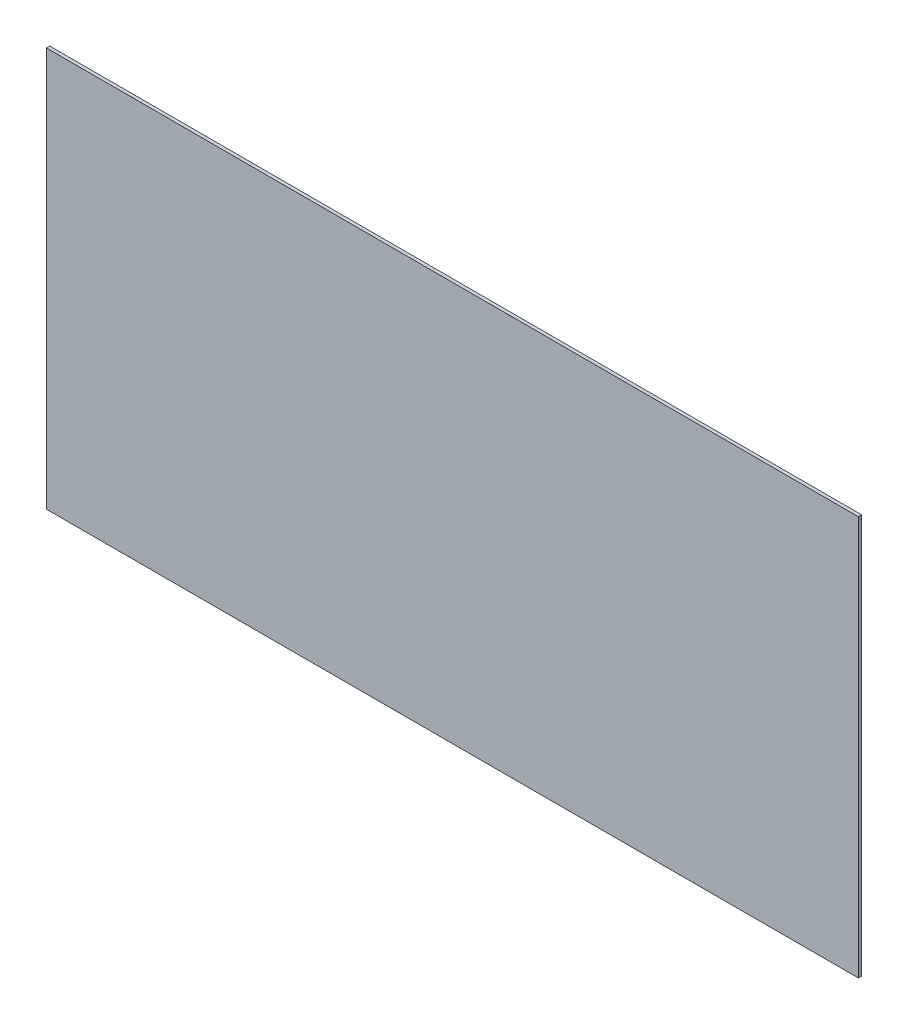
ISO-10303-21;
HEADER;
FILE_DESCRIPTION(('STEP AP214'),'2;1');
FILE_NAME('part.step','',(''),(''),'','','');
FILE_SCHEMA(('AUTOMOTIVE_DESIGN { 1 0 10303 214 1 1 1 1 }'));
ENDSEC;
DATA;
#1=APPLICATION_CONTEXT('core data for automotive mechanical design processes');
#2=APPLICATION_PROTOCOL_DEFINITION('international standard','automotive_design',2000,#1);
#3=PRODUCT_CONTEXT('',#1,'mechanical');
#4=PRODUCT('Part','Part','',(#3));
#5=PRODUCT_RELATED_PRODUCT_CATEGORY('part','',(#4));
#6=PRODUCT_DEFINITION_FORMATION('','',#4);
#7=PRODUCT_DEFINITION_CONTEXT('part definition',#1,'design');
#8=PRODUCT_DEFINITION('design','',#6,#7);
#9=PRODUCT_DEFINITION_SHAPE('','',#8);
#10=(LENGTH_UNIT() NAMED_UNIT(*) SI_UNIT(.MILLI.,.METRE.));
#11=(NAMED_UNIT(*) PLANE_ANGLE_UNIT() SI_UNIT($,.RADIAN.));
#12=(NAMED_UNIT(*) SI_UNIT($,.STERADIAN.) SOLID_ANGLE_UNIT());
#13=UNCERTAINTY_MEASURE_WITH_UNIT(LENGTH_MEASURE(1.E-05),#10,'distance_accuracy_value','');
#14=(GEOMETRIC_REPRESENTATION_CONTEXT(3) GLOBAL_UNCERTAINTY_ASSIGNED_CONTEXT((#13)) GLOBAL_UNIT_ASSIGNED_CONTEXT((#10,
#11,#12)) REPRESENTATION_CONTEXT('',''));
#15=CARTESIAN_POINT('',(0.,0.,0.));
#16=DIRECTION('',(0.,0.,1.));
#17=DIRECTION('',(1.,0.,0.));
#18=AXIS2_PLACEMENT_3D('',#15,#16,#17);
#19=CARTESIAN_POINT('',(-125.,-60.,151.));
#20=DIRECTION('',(1.,0.,0.));
#21=DIRECTION('',(0.,1.,0.));
#22=AXIS2_PLACEMENT_3D('',#19,#20,#21);
#23=PLANE('',#22);
#24=DIRECTION('',(0.,-1.,0.));
#25=VECTOR('',#24,1.);
#26=CARTESIAN_POINT('',(-125.,-60.,150.));
#27=LINE('',#26,#25);
#28=CARTESIAN_POINT('',(-125.,63.,150.));
#29=VERTEX_POINT('',#28);
#30=CARTESIAN_POINT('',(-125.,-60.,150.));
#31=VERTEX_POINT('',#30);
#32=EDGE_CURVE('E104',#29,#31,#27,.T.);
#33=ORIENTED_EDGE('',*,*,#32,.T.);
#34=DIRECTION('',(0.,0.,-1.));
#35=VECTOR('',#34,1.);
#36=CARTESIAN_POINT('',(-125.,-60.,151.));
#37=LINE('',#36,#35);
#38=CARTESIAN_POINT('',(-125.,-60.,151.));
#39=VERTEX_POINT('',#38);
#40=EDGE_CURVE('E11',#39,#31,#37,.T.);
#41=ORIENTED_EDGE('',*,*,#40,.F.);
#42=DIRECTION('',(0.,-1.,0.));
#43=VECTOR('',#42,1.);
#44=CARTESIAN_POINT('',(-125.,-60.,151.));
#45=LINE('',#44,#43);
#46=CARTESIAN_POINT('',(-125.,63.,151.));
#47=VERTEX_POINT('',#46);
#48=EDGE_CURVE('E92',#47,#39,#45,.T.);
#49=ORIENTED_EDGE('',*,*,#48,.F.);
#50=DIRECTION('',(0.,0.,-1.));
#51=VECTOR('',#50,1.);
#52=CARTESIAN_POINT('',(-125.,63.,151.));
#53=LINE('',#52,#51);
#54=EDGE_CURVE('E100',#47,#29,#53,.T.);
#55=ORIENTED_EDGE('',*,*,#54,.T.);
#56=EDGE_LOOP('',(#33,#41,#49,#55));
#57=FACE_BOUND('',#56,.T.);
#58=ADVANCED_FACE('F41',(#57),#23,.F.);
#59=CARTESIAN_POINT('',(-125.,-60.,151.));
#60=DIRECTION('',(0.,1.,0.));
#61=DIRECTION('',(0.,0.,1.));
#62=AXIS2_PLACEMENT_3D('',#59,#60,#61);
#63=PLANE('',#62);
#64=DIRECTION('',(1.,0.,0.));
#65=VECTOR('',#64,1.);
#66=CARTESIAN_POINT('',(-125.,-60.,150.));
#67=LINE('',#66,#65);
#68=CARTESIAN_POINT('',(125.,-60.,150.));
#69=VERTEX_POINT('',#68);
#70=EDGE_CURVE('E96',#31,#69,#67,.T.);
#71=ORIENTED_EDGE('',*,*,#70,.T.);
#72=DIRECTION('',(0.,0.,-1.));
#73=VECTOR('',#72,1.);
#74=CARTESIAN_POINT('',(125.,-60.,151.));
#75=LINE('',#74,#73);
#76=CARTESIAN_POINT('',(125.,-60.,151.));
#77=VERTEX_POINT('',#76);
#78=EDGE_CURVE('E49',#77,#69,#75,.T.);
#79=ORIENTED_EDGE('',*,*,#78,.F.);
#80=DIRECTION('',(1.,0.,0.));
#81=VECTOR('',#80,1.);
#82=CARTESIAN_POINT('',(-125.,-60.,151.));
#83=LINE('',#82,#81);
#84=EDGE_CURVE('E87',#39,#77,#83,.T.);
#85=ORIENTED_EDGE('',*,*,#84,.F.);
#86=ORIENTED_EDGE('',*,*,#40,.T.);
#87=EDGE_LOOP('',(#71,#79,#85,#86));
#88=FACE_BOUND('',#87,.T.);
#89=ADVANCED_FACE('F95',(#88),#63,.F.);
#90=CARTESIAN_POINT('',(125.,-60.,151.));
#91=DIRECTION('',(-1.,0.,0.));
#92=DIRECTION('',(0.,-1.,0.));
#93=AXIS2_PLACEMENT_3D('',#90,#91,#92);
#94=PLANE('',#93);
#95=DIRECTION('',(0.,1.,0.));
#96=VECTOR('',#95,1.);
#97=CARTESIAN_POINT('',(125.,-60.,150.));
#98=LINE('',#97,#96);
#99=CARTESIAN_POINT('',(125.,63.,150.));
#100=VERTEX_POINT('',#99);
#101=EDGE_CURVE('E74',#69,#100,#98,.T.);
#102=ORIENTED_EDGE('',*,*,#101,.T.);
#103=DIRECTION('',(0.,0.,-1.));
#104=VECTOR('',#103,1.);
#105=CARTESIAN_POINT('',(125.,63.,151.));
#106=LINE('',#105,#104);
#107=CARTESIAN_POINT('',(125.,63.,151.));
#108=VERTEX_POINT('',#107);
#109=EDGE_CURVE('E97',#108,#100,#106,.T.);
#110=ORIENTED_EDGE('',*,*,#109,.F.);
#111=DIRECTION('',(0.,1.,0.));
#112=VECTOR('',#111,1.);
#113=CARTESIAN_POINT('',(125.,-60.,151.));
#114=LINE('',#113,#112);
#115=EDGE_CURVE('E90',#77,#108,#114,.T.);
#116=ORIENTED_EDGE('',*,*,#115,.F.);
#117=ORIENTED_EDGE('',*,*,#78,.T.);
#118=EDGE_LOOP('',(#102,#110,#116,#117));
#119=FACE_BOUND('',#118,.T.);
#120=ADVANCED_FACE('F98',(#119),#94,.F.);
#121=CARTESIAN_POINT('',(-125.,63.,151.));
#122=DIRECTION('',(0.,-1.,0.));
#123=DIRECTION('',(0.,0.,-1.));
#124=AXIS2_PLACEMENT_3D('',#121,#122,#123);
#125=PLANE('',#124);
#126=DIRECTION('',(-1.,0.,0.));
#127=VECTOR('',#126,1.);
#128=CARTESIAN_POINT('',(-125.,63.,150.));
#129=LINE('',#128,#127);
#130=EDGE_CURVE('E80',#100,#29,#129,.T.);
#131=ORIENTED_EDGE('',*,*,#130,.T.);
#132=ORIENTED_EDGE('',*,*,#54,.F.);
#133=DIRECTION('',(-1.,0.,0.));
#134=VECTOR('',#133,1.);
#135=CARTESIAN_POINT('',(-125.,63.,151.));
#136=LINE('',#135,#134);
#137=EDGE_CURVE('E57',#108,#47,#136,.T.);
#138=ORIENTED_EDGE('',*,*,#137,.F.);
#139=ORIENTED_EDGE('',*,*,#109,.T.);
#140=EDGE_LOOP('',(#131,#132,#138,#139));
#141=FACE_BOUND('',#140,.T.);
#142=ADVANCED_FACE('F111',(#141),#125,.F.);
#143=CARTESIAN_POINT('',(0.,0.,151.));
#144=DIRECTION('',(0.,0.,-1.));
#145=DIRECTION('',(-1.,0.,0.));
#146=AXIS2_PLACEMENT_3D('',#143,#144,#145);
#147=PLANE('',#146);
#148=ORIENTED_EDGE('',*,*,#48,.T.);
#149=ORIENTED_EDGE('',*,*,#84,.T.);
#150=ORIENTED_EDGE('',*,*,#115,.T.);
#151=ORIENTED_EDGE('',*,*,#137,.T.);
#152=EDGE_LOOP('',(#148,#149,#150,#151));
#153=FACE_BOUND('',#152,.T.);
#154=ADVANCED_FACE('F88',(#153),#147,.F.);
#155=CARTESIAN_POINT('',(0.,0.,150.));
#156=DIRECTION('',(0.,0.,-1.));
#157=DIRECTION('',(-1.,0.,0.));
#158=AXIS2_PLACEMENT_3D('',#155,#156,#157);
#159=PLANE('',#158);
#160=ORIENTED_EDGE('',*,*,#32,.F.);
#161=ORIENTED_EDGE('',*,*,#130,.F.);
#162=ORIENTED_EDGE('',*,*,#101,.F.);
#163=ORIENTED_EDGE('',*,*,#70,.F.);
#164=EDGE_LOOP('',(#160,#161,#162,#163));
#165=FACE_BOUND('',#164,.T.);
#166=ADVANCED_FACE('F114',(#165),#159,.T.);
#167=CLOSED_SHELL('',(#58,#89,#120,#142,#154,#166));
#168=MANIFOLD_SOLID_BREP('B2',#167);
#169=ADVANCED_BREP_SHAPE_REPRESENTATION('',(#18,#168),#14);
#170=SHAPE_DEFINITION_REPRESENTATION(#9,#169);
ENDSEC;
END-ISO-10303-21;
